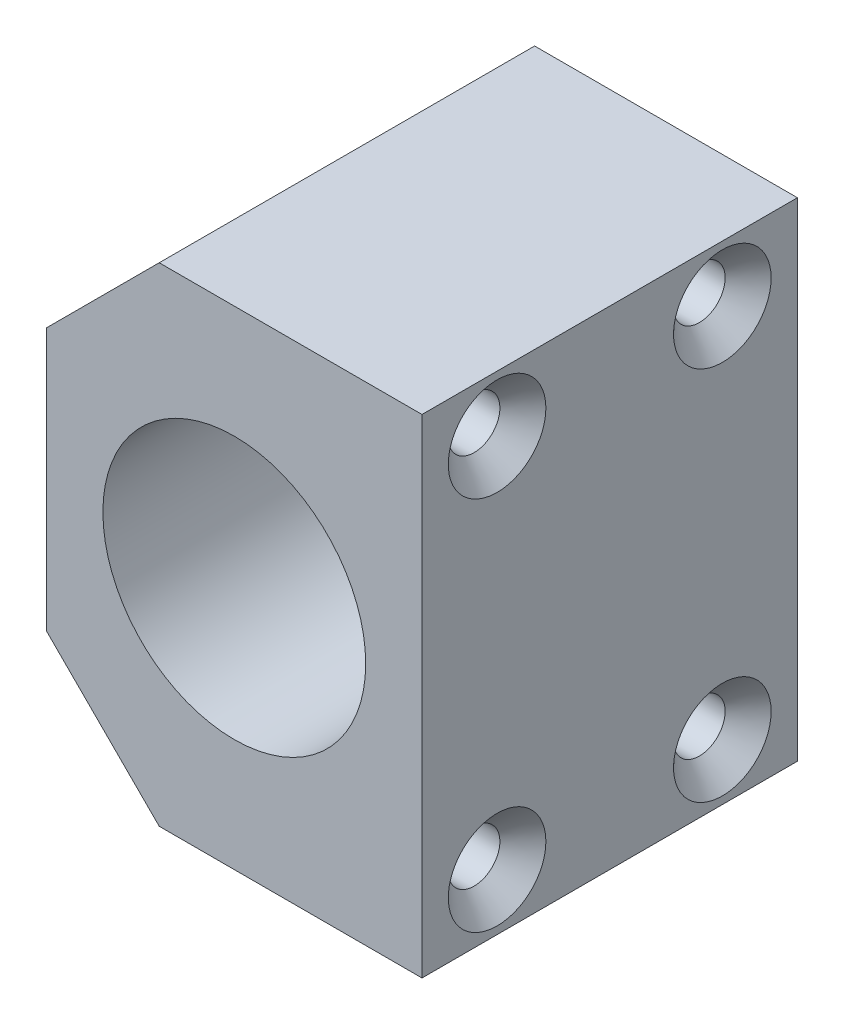
ISO-10303-21;
HEADER;
FILE_DESCRIPTION(('STEP AP214'),'2;1');
FILE_NAME('part.step','',(''),(''),'','','');
FILE_SCHEMA(('AUTOMOTIVE_DESIGN { 1 0 10303 214 1 1 1 1 }'));
ENDSEC;
DATA;
#1=APPLICATION_CONTEXT('core data for automotive mechanical design processes');
#2=APPLICATION_PROTOCOL_DEFINITION('international standard','automotive_design',2000,#1);
#3=PRODUCT_CONTEXT('',#1,'mechanical');
#4=PRODUCT('Part','Part','',(#3));
#5=PRODUCT_RELATED_PRODUCT_CATEGORY('part','',(#4));
#6=PRODUCT_DEFINITION_FORMATION('','',#4);
#7=PRODUCT_DEFINITION_CONTEXT('part definition',#1,'design');
#8=PRODUCT_DEFINITION('design','',#6,#7);
#9=PRODUCT_DEFINITION_SHAPE('','',#8);
#10=(LENGTH_UNIT() NAMED_UNIT(*) SI_UNIT(.MILLI.,.METRE.));
#11=(NAMED_UNIT(*) PLANE_ANGLE_UNIT() SI_UNIT($,.RADIAN.));
#12=(NAMED_UNIT(*) SI_UNIT($,.STERADIAN.) SOLID_ANGLE_UNIT());
#13=UNCERTAINTY_MEASURE_WITH_UNIT(LENGTH_MEASURE(1.E-05),#10,'distance_accuracy_value','');
#14=(GEOMETRIC_REPRESENTATION_CONTEXT(3) GLOBAL_UNCERTAINTY_ASSIGNED_CONTEXT((#13)) GLOBAL_UNIT_ASSIGNED_CONTEXT((#10,
#11,#12)) REPRESENTATION_CONTEXT('',''));
#15=CARTESIAN_POINT('',(0.,0.,0.));
#16=DIRECTION('',(0.,0.,1.));
#17=DIRECTION('',(1.,0.,0.));
#18=AXIS2_PLACEMENT_3D('',#15,#16,#17);
#19=CARTESIAN_POINT('',(20.,26.,40.));
#20=DIRECTION('',(-1.,0.,0.));
#21=DIRECTION('',(0.,0.,1.));
#22=AXIS2_PLACEMENT_3D('',#19,#20,#21);
#23=PLANE('',#22);
#24=CARTESIAN_POINT('',(20.,20.,32.));
#25=DIRECTION('',(1.,0.,0.));
#26=DIRECTION('',(0.,0.,-1.));
#27=AXIS2_PLACEMENT_3D('',#24,#25,#26);
#28=CIRCLE('',#27,5.2);
#29=CARTESIAN_POINT('',(20.,20.,26.8));
#30=VERTEX_POINT('',#29);
#31=EDGE_CURVE('E163',#30,#30,#28,.T.);
#32=ORIENTED_EDGE('',*,*,#31,.F.);
#33=EDGE_LOOP('',(#32));
#34=FACE_BOUND('',#33,.T.);
#35=CARTESIAN_POINT('',(20.,20.,8.));
#36=DIRECTION('',(1.,0.,0.));
#37=DIRECTION('',(0.,0.,-1.));
#38=AXIS2_PLACEMENT_3D('',#35,#36,#37);
#39=CIRCLE('',#38,5.2);
#40=CARTESIAN_POINT('',(20.,20.,2.8));
#41=VERTEX_POINT('',#40);
#42=EDGE_CURVE('E167',#41,#41,#39,.T.);
#43=ORIENTED_EDGE('',*,*,#42,.F.);
#44=EDGE_LOOP('',(#43));
#45=FACE_BOUND('',#44,.T.);
#46=CARTESIAN_POINT('',(20.,-20.,8.));
#47=DIRECTION('',(1.,0.,0.));
#48=DIRECTION('',(0.,0.,-1.));
#49=AXIS2_PLACEMENT_3D('',#46,#47,#48);
#50=CIRCLE('',#49,5.2);
#51=CARTESIAN_POINT('',(20.,-20.,2.8));
#52=VERTEX_POINT('',#51);
#53=EDGE_CURVE('E171',#52,#52,#50,.T.);
#54=ORIENTED_EDGE('',*,*,#53,.F.);
#55=EDGE_LOOP('',(#54));
#56=FACE_BOUND('',#55,.T.);
#57=CARTESIAN_POINT('',(20.,-20.,32.));
#58=DIRECTION('',(1.,0.,0.));
#59=DIRECTION('',(0.,0.,-1.));
#60=AXIS2_PLACEMENT_3D('',#57,#58,#59);
#61=CIRCLE('',#60,5.2);
#62=CARTESIAN_POINT('',(20.,-20.,26.8));
#63=VERTEX_POINT('',#62);
#64=EDGE_CURVE('E174',#63,#63,#61,.T.);
#65=ORIENTED_EDGE('',*,*,#64,.F.);
#66=EDGE_LOOP('',(#65));
#67=FACE_BOUND('',#66,.T.);
#68=DIRECTION('',(0.,1.,0.));
#69=VECTOR('',#68,1.);
#70=CARTESIAN_POINT('',(20.,26.,0.));
#71=LINE('',#70,#69);
#72=CARTESIAN_POINT('',(20.,-26.,0.));
#73=VERTEX_POINT('',#72);
#74=CARTESIAN_POINT('',(20.,26.,0.));
#75=VERTEX_POINT('',#74);
#76=EDGE_CURVE('E119',#73,#75,#71,.T.);
#77=ORIENTED_EDGE('',*,*,#76,.T.);
#78=DIRECTION('',(0.,0.,-1.));
#79=VECTOR('',#78,1.);
#80=CARTESIAN_POINT('',(20.,26.,40.));
#81=LINE('',#80,#79);
#82=CARTESIAN_POINT('',(20.,26.,40.));
#83=VERTEX_POINT('',#82);
#84=EDGE_CURVE('E11',#83,#75,#81,.T.);
#85=ORIENTED_EDGE('',*,*,#84,.F.);
#86=DIRECTION('',(0.,1.,0.));
#87=VECTOR('',#86,1.);
#88=CARTESIAN_POINT('',(20.,26.,40.));
#89=LINE('',#88,#87);
#90=CARTESIAN_POINT('',(20.,-26.,40.));
#91=VERTEX_POINT('',#90);
#92=EDGE_CURVE('E130',#91,#83,#89,.T.);
#93=ORIENTED_EDGE('',*,*,#92,.F.);
#94=DIRECTION('',(0.,0.,-1.));
#95=VECTOR('',#94,1.);
#96=CARTESIAN_POINT('',(20.,-26.,40.));
#97=LINE('',#96,#95);
#98=EDGE_CURVE('E115',#91,#73,#97,.T.);
#99=ORIENTED_EDGE('',*,*,#98,.T.);
#100=EDGE_LOOP('',(#77,#85,#93,#99));
#101=FACE_BOUND('',#100,.T.);
#102=ADVANCED_FACE('F32',(#34,#45,#56,#67,#101),#23,.F.);
#103=CARTESIAN_POINT('',(-8.00000000000001,26.,40.));
#104=DIRECTION('',(0.,-1.,0.));
#105=DIRECTION('',(0.,0.,-1.));
#106=AXIS2_PLACEMENT_3D('',#103,#104,#105);
#107=PLANE('',#106);
#108=DIRECTION('',(-1.,0.,0.));
#109=VECTOR('',#108,1.);
#110=CARTESIAN_POINT('',(-8.00000000000001,26.,0.));
#111=LINE('',#110,#109);
#112=CARTESIAN_POINT('',(-8.00000000000001,26.,0.));
#113=VERTEX_POINT('',#112);
#114=EDGE_CURVE('E122',#75,#113,#111,.T.);
#115=ORIENTED_EDGE('',*,*,#114,.T.);
#116=DIRECTION('',(0.,0.,-1.));
#117=VECTOR('',#116,1.);
#118=CARTESIAN_POINT('',(-8.00000000000001,26.,40.));
#119=LINE('',#118,#117);
#120=CARTESIAN_POINT('',(-8.00000000000001,26.,40.));
#121=VERTEX_POINT('',#120);
#122=EDGE_CURVE('E40',#121,#113,#119,.T.);
#123=ORIENTED_EDGE('',*,*,#122,.F.);
#124=DIRECTION('',(-1.,0.,0.));
#125=VECTOR('',#124,1.);
#126=CARTESIAN_POINT('',(-8.00000000000001,26.,40.));
#127=LINE('',#126,#125);
#128=EDGE_CURVE('E86',#83,#121,#127,.T.);
#129=ORIENTED_EDGE('',*,*,#128,.F.);
#130=ORIENTED_EDGE('',*,*,#84,.T.);
#131=EDGE_LOOP('',(#115,#123,#129,#130));
#132=FACE_BOUND('',#131,.T.);
#133=ADVANCED_FACE('F155',(#132),#107,.F.);
#134=CARTESIAN_POINT('',(-8.00000000000001,26.,40.));
#135=DIRECTION('',(0.707106781186548,-0.707106781186548,0.));
#136=DIRECTION('',(0.707106781186548,0.707106781186548,0.));
#137=AXIS2_PLACEMENT_3D('',#134,#135,#136);
#138=PLANE('',#137);
#139=DIRECTION('',(-0.707106781186548,-0.707106781186548,0.));
#140=VECTOR('',#139,1.);
#141=CARTESIAN_POINT('',(-8.00000000000001,26.,0.));
#142=LINE('',#141,#140);
#143=CARTESIAN_POINT('',(-20.,14.,0.));
#144=VERTEX_POINT('',#143);
#145=EDGE_CURVE('E125',#113,#144,#142,.T.);
#146=ORIENTED_EDGE('',*,*,#145,.T.);
#147=DIRECTION('',(0.,0.,-1.));
#148=VECTOR('',#147,1.);
#149=CARTESIAN_POINT('',(-20.,14.,40.));
#150=LINE('',#149,#148);
#151=CARTESIAN_POINT('',(-20.,14.,40.));
#152=VERTEX_POINT('',#151);
#153=EDGE_CURVE('E110',#152,#144,#150,.T.);
#154=ORIENTED_EDGE('',*,*,#153,.F.);
#155=DIRECTION('',(-0.707106781186548,-0.707106781186548,0.));
#156=VECTOR('',#155,1.);
#157=CARTESIAN_POINT('',(-8.00000000000001,26.,40.));
#158=LINE('',#157,#156);
#159=EDGE_CURVE('E101',#121,#152,#158,.T.);
#160=ORIENTED_EDGE('',*,*,#159,.F.);
#161=ORIENTED_EDGE('',*,*,#122,.T.);
#162=EDGE_LOOP('',(#146,#154,#160,#161));
#163=FACE_BOUND('',#162,.T.);
#164=ADVANCED_FACE('F136',(#163),#138,.F.);
#165=CARTESIAN_POINT('',(-20.,14.,40.));
#166=DIRECTION('',(1.,0.,0.));
#167=DIRECTION('',(0.,0.,-1.));
#168=AXIS2_PLACEMENT_3D('',#165,#166,#167);
#169=PLANE('',#168);
#170=DIRECTION('',(0.,-1.,0.));
#171=VECTOR('',#170,1.);
#172=CARTESIAN_POINT('',(-20.,14.,0.));
#173=LINE('',#172,#171);
#174=CARTESIAN_POINT('',(-20.,-14.,0.));
#175=VERTEX_POINT('',#174);
#176=EDGE_CURVE('E109',#144,#175,#173,.T.);
#177=ORIENTED_EDGE('',*,*,#176,.T.);
#178=DIRECTION('',(0.,0.,-1.));
#179=VECTOR('',#178,1.);
#180=CARTESIAN_POINT('',(-20.,-14.,40.));
#181=LINE('',#180,#179);
#182=CARTESIAN_POINT('',(-20.,-14.,40.));
#183=VERTEX_POINT('',#182);
#184=EDGE_CURVE('E106',#183,#175,#181,.T.);
#185=ORIENTED_EDGE('',*,*,#184,.F.);
#186=DIRECTION('',(0.,-1.,0.));
#187=VECTOR('',#186,1.);
#188=CARTESIAN_POINT('',(-20.,14.,40.));
#189=LINE('',#188,#187);
#190=EDGE_CURVE('E95',#152,#183,#189,.T.);
#191=ORIENTED_EDGE('',*,*,#190,.F.);
#192=ORIENTED_EDGE('',*,*,#153,.T.);
#193=EDGE_LOOP('',(#177,#185,#191,#192));
#194=FACE_BOUND('',#193,.T.);
#195=ADVANCED_FACE('F107',(#194),#169,.F.);
#196=CARTESIAN_POINT('',(-20.,-14.,40.));
#197=DIRECTION('',(0.707106781186547,0.707106781186548,0.));
#198=DIRECTION('',(-0.707106781186548,0.707106781186547,0.));
#199=AXIS2_PLACEMENT_3D('',#196,#197,#198);
#200=PLANE('',#199);
#201=DIRECTION('',(0.707106781186548,-0.707106781186547,0.));
#202=VECTOR('',#201,1.);
#203=CARTESIAN_POINT('',(-20.,-14.,0.));
#204=LINE('',#203,#202);
#205=CARTESIAN_POINT('',(-8.00000000000001,-26.,0.));
#206=VERTEX_POINT('',#205);
#207=EDGE_CURVE('E72',#175,#206,#204,.T.);
#208=ORIENTED_EDGE('',*,*,#207,.T.);
#209=DIRECTION('',(0.,0.,-1.));
#210=VECTOR('',#209,1.);
#211=CARTESIAN_POINT('',(-8.00000000000001,-26.,40.));
#212=LINE('',#211,#210);
#213=CARTESIAN_POINT('',(-8.00000000000001,-26.,40.));
#214=VERTEX_POINT('',#213);
#215=EDGE_CURVE('E111',#214,#206,#212,.T.);
#216=ORIENTED_EDGE('',*,*,#215,.F.);
#217=DIRECTION('',(0.707106781186548,-0.707106781186547,0.));
#218=VECTOR('',#217,1.);
#219=CARTESIAN_POINT('',(-20.,-14.,40.));
#220=LINE('',#219,#218);
#221=EDGE_CURVE('E99',#183,#214,#220,.T.);
#222=ORIENTED_EDGE('',*,*,#221,.F.);
#223=ORIENTED_EDGE('',*,*,#184,.T.);
#224=EDGE_LOOP('',(#208,#216,#222,#223));
#225=FACE_BOUND('',#224,.T.);
#226=ADVANCED_FACE('F113',(#225),#200,.F.);
#227=CARTESIAN_POINT('',(-8.00000000000001,-26.,40.));
#228=DIRECTION('',(0.,1.,0.));
#229=DIRECTION('',(0.,0.,1.));
#230=AXIS2_PLACEMENT_3D('',#227,#228,#229);
#231=PLANE('',#230);
#232=DIRECTION('',(1.,0.,0.));
#233=VECTOR('',#232,1.);
#234=CARTESIAN_POINT('',(-8.00000000000001,-26.,0.));
#235=LINE('',#234,#233);
#236=EDGE_CURVE('E78',#206,#73,#235,.T.);
#237=ORIENTED_EDGE('',*,*,#236,.T.);
#238=ORIENTED_EDGE('',*,*,#98,.F.);
#239=DIRECTION('',(1.,0.,0.));
#240=VECTOR('',#239,1.);
#241=CARTESIAN_POINT('',(-8.00000000000001,-26.,40.));
#242=LINE('',#241,#240);
#243=EDGE_CURVE('E48',#214,#91,#242,.T.);
#244=ORIENTED_EDGE('',*,*,#243,.F.);
#245=ORIENTED_EDGE('',*,*,#215,.T.);
#246=EDGE_LOOP('',(#237,#238,#244,#245));
#247=FACE_BOUND('',#246,.T.);
#248=ADVANCED_FACE('F143',(#247),#231,.F.);
#249=CARTESIAN_POINT('',(0.,0.,40.));
#250=DIRECTION('',(0.,0.,1.));
#251=DIRECTION('',(1.,0.,0.));
#252=AXIS2_PLACEMENT_3D('',#249,#250,#251);
#253=PLANE('',#252);
#254=CARTESIAN_POINT('',(0.,0.,40.));
#255=DIRECTION('',(0.,0.,1.));
#256=DIRECTION('',(1.,0.,0.));
#257=AXIS2_PLACEMENT_3D('',#254,#255,#256);
#258=CIRCLE('',#257,14.);
#259=CARTESIAN_POINT('',(14.,0.,40.));
#260=VERTEX_POINT('',#259);
#261=EDGE_CURVE('E189',#260,#260,#258,.T.);
#262=ORIENTED_EDGE('',*,*,#261,.F.);
#263=EDGE_LOOP('',(#262));
#264=FACE_BOUND('',#263,.T.);
#265=ORIENTED_EDGE('',*,*,#92,.T.);
#266=ORIENTED_EDGE('',*,*,#128,.T.);
#267=ORIENTED_EDGE('',*,*,#159,.T.);
#268=ORIENTED_EDGE('',*,*,#190,.T.);
#269=ORIENTED_EDGE('',*,*,#221,.T.);
#270=ORIENTED_EDGE('',*,*,#243,.T.);
#271=EDGE_LOOP('',(#265,#266,#267,#268,#269,#270));
#272=FACE_BOUND('',#271,.T.);
#273=ADVANCED_FACE('F97',(#264,#272),#253,.T.);
#274=CARTESIAN_POINT('',(0.,0.,0.));
#275=DIRECTION('',(0.,0.,1.));
#276=DIRECTION('',(1.,0.,0.));
#277=AXIS2_PLACEMENT_3D('',#274,#275,#276);
#278=PLANE('',#277);
#279=CARTESIAN_POINT('',(0.,0.,0.));
#280=DIRECTION('',(0.,0.,1.));
#281=DIRECTION('',(1.,0.,0.));
#282=AXIS2_PLACEMENT_3D('',#279,#280,#281);
#283=CIRCLE('',#282,14.);
#284=CARTESIAN_POINT('',(14.,0.,0.));
#285=VERTEX_POINT('',#284);
#286=EDGE_CURVE('E123',#285,#285,#283,.T.);
#287=ORIENTED_EDGE('',*,*,#286,.T.);
#288=EDGE_LOOP('',(#287));
#289=FACE_BOUND('',#288,.T.);
#290=ORIENTED_EDGE('',*,*,#76,.F.);
#291=ORIENTED_EDGE('',*,*,#236,.F.);
#292=ORIENTED_EDGE('',*,*,#207,.F.);
#293=ORIENTED_EDGE('',*,*,#176,.F.);
#294=ORIENTED_EDGE('',*,*,#145,.F.);
#295=ORIENTED_EDGE('',*,*,#114,.F.);
#296=EDGE_LOOP('',(#290,#291,#292,#293,#294,#295));
#297=FACE_BOUND('',#296,.T.);
#298=ADVANCED_FACE('F139',(#289,#297),#278,.F.);
#299=CARTESIAN_POINT('',(0.,0.,0.));
#300=DIRECTION('',(0.,0.,1.));
#301=DIRECTION('',(1.,0.,0.));
#302=AXIS2_PLACEMENT_3D('',#299,#300,#301);
#303=CYLINDRICAL_SURFACE('',#302,14.);
#304=ORIENTED_EDGE('',*,*,#286,.F.);
#305=EDGE_LOOP('',(#304));
#306=FACE_BOUND('',#305,.T.);
#307=ORIENTED_EDGE('',*,*,#261,.T.);
#308=EDGE_LOOP('',(#307));
#309=FACE_BOUND('',#308,.T.);
#310=ADVANCED_FACE('F197',(#306,#309),#303,.F.);
#311=CARTESIAN_POINT('',(7.99999999999999,-20.,32.));
#312=DIRECTION('',(1.,0.,0.));
#313=DIRECTION('',(0.,0.,-1.));
#314=AXIS2_PLACEMENT_3D('',#311,#312,#313);
#315=CONICAL_SURFACE('',#314,2.74999999999998,1.02974425867665);
#316=CARTESIAN_POINT('',(6.34763329767421,-20.,32.));
#317=VERTEX_POINT('',#316);
#318=VERTEX_LOOP('',#317);
#319=FACE_BOUND('',#318,.T.);
#320=CARTESIAN_POINT('',(7.99999999999999,-20.,32.));
#321=DIRECTION('',(1.,0.,0.));
#322=DIRECTION('',(0.,0.,-1.));
#323=AXIS2_PLACEMENT_3D('',#320,#321,#322);
#324=CIRCLE('',#323,2.74999999999998);
#325=CARTESIAN_POINT('',(7.99999999999999,-20.,29.25));
#326=VERTEX_POINT('',#325);
#327=EDGE_CURVE('E180',#326,#326,#324,.T.);
#328=ORIENTED_EDGE('',*,*,#327,.T.);
#329=EDGE_LOOP('',(#328));
#330=FACE_BOUND('',#329,.T.);
#331=ADVANCED_FACE('F199',(#319,#330),#315,.F.);
#332=CARTESIAN_POINT('',(20.,-20.,32.));
#333=DIRECTION('',(1.,0.,0.));
#334=DIRECTION('',(0.,0.,-1.));
#335=AXIS2_PLACEMENT_3D('',#332,#333,#334);
#336=CYLINDRICAL_SURFACE('',#335,2.74999999999999);
#337=ORIENTED_EDGE('',*,*,#327,.F.);
#338=EDGE_LOOP('',(#337));
#339=FACE_BOUND('',#338,.T.);
#340=CARTESIAN_POINT('',(17.55,-20.,32.));
#341=DIRECTION('',(1.,0.,0.));
#342=DIRECTION('',(0.,0.,-1.));
#343=AXIS2_PLACEMENT_3D('',#340,#341,#342);
#344=CIRCLE('',#343,2.75);
#345=CARTESIAN_POINT('',(17.55,-20.,29.25));
#346=VERTEX_POINT('',#345);
#347=EDGE_CURVE('E176',#346,#346,#344,.T.);
#348=ORIENTED_EDGE('',*,*,#347,.T.);
#349=EDGE_LOOP('',(#348));
#350=FACE_BOUND('',#349,.T.);
#351=ADVANCED_FACE('F206',(#339,#350),#336,.F.);
#352=CARTESIAN_POINT('',(20.,-20.,32.));
#353=DIRECTION('',(1.,0.,0.));
#354=DIRECTION('',(0.,0.,-1.));
#355=AXIS2_PLACEMENT_3D('',#352,#353,#354);
#356=CONICAL_SURFACE('',#355,5.2,0.785398163397448);
#357=ORIENTED_EDGE('',*,*,#347,.F.);
#358=EDGE_LOOP('',(#357));
#359=FACE_BOUND('',#358,.T.);
#360=ORIENTED_EDGE('',*,*,#64,.T.);
#361=EDGE_LOOP('',(#360));
#362=FACE_BOUND('',#361,.T.);
#363=ADVANCED_FACE('F214',(#359,#362),#356,.F.);
#364=CARTESIAN_POINT('',(7.99999999999999,-20.,8.));
#365=DIRECTION('',(1.,0.,0.));
#366=DIRECTION('',(0.,0.,-1.));
#367=AXIS2_PLACEMENT_3D('',#364,#365,#366);
#368=CONICAL_SURFACE('',#367,2.74999999999999,1.02974425867665);
#369=CARTESIAN_POINT('',(6.34763329767421,-20.,8.));
#370=VERTEX_POINT('',#369);
#371=VERTEX_LOOP('',#370);
#372=FACE_BOUND('',#371,.T.);
#373=CARTESIAN_POINT('',(7.99999999999999,-20.,8.));
#374=DIRECTION('',(1.,0.,0.));
#375=DIRECTION('',(0.,0.,-1.));
#376=AXIS2_PLACEMENT_3D('',#373,#374,#375);
#377=CIRCLE('',#376,2.74999999999999);
#378=CARTESIAN_POINT('',(7.99999999999999,-20.,5.25000000000001));
#379=VERTEX_POINT('',#378);
#380=EDGE_CURVE('E177',#379,#379,#377,.T.);
#381=ORIENTED_EDGE('',*,*,#380,.T.);
#382=EDGE_LOOP('',(#381));
#383=FACE_BOUND('',#382,.T.);
#384=ADVANCED_FACE('F218',(#372,#383),#368,.F.);
#385=CARTESIAN_POINT('',(20.,-20.,8.));
#386=DIRECTION('',(1.,0.,0.));
#387=DIRECTION('',(0.,0.,-1.));
#388=AXIS2_PLACEMENT_3D('',#385,#386,#387);
#389=CYLINDRICAL_SURFACE('',#388,2.74999999999999);
#390=ORIENTED_EDGE('',*,*,#380,.F.);
#391=EDGE_LOOP('',(#390));
#392=FACE_BOUND('',#391,.T.);
#393=CARTESIAN_POINT('',(17.55,-20.,8.));
#394=DIRECTION('',(1.,0.,0.));
#395=DIRECTION('',(0.,0.,-1.));
#396=AXIS2_PLACEMENT_3D('',#393,#394,#395);
#397=CIRCLE('',#396,2.75);
#398=CARTESIAN_POINT('',(17.55,-20.,5.25));
#399=VERTEX_POINT('',#398);
#400=EDGE_CURVE('E183',#399,#399,#397,.T.);
#401=ORIENTED_EDGE('',*,*,#400,.T.);
#402=EDGE_LOOP('',(#401));
#403=FACE_BOUND('',#402,.T.);
#404=ADVANCED_FACE('F222',(#392,#403),#389,.F.);
#405=CARTESIAN_POINT('',(20.,-20.,8.));
#406=DIRECTION('',(1.,0.,0.));
#407=DIRECTION('',(0.,0.,-1.));
#408=AXIS2_PLACEMENT_3D('',#405,#406,#407);
#409=CONICAL_SURFACE('',#408,5.2,0.785398163397448);
#410=ORIENTED_EDGE('',*,*,#400,.F.);
#411=EDGE_LOOP('',(#410));
#412=FACE_BOUND('',#411,.T.);
#413=ORIENTED_EDGE('',*,*,#53,.T.);
#414=EDGE_LOOP('',(#413));
#415=FACE_BOUND('',#414,.T.);
#416=ADVANCED_FACE('F226',(#412,#415),#409,.F.);
#417=CARTESIAN_POINT('',(7.99999999999999,20.,8.));
#418=DIRECTION('',(1.,0.,0.));
#419=DIRECTION('',(0.,0.,-1.));
#420=AXIS2_PLACEMENT_3D('',#417,#418,#419);
#421=CONICAL_SURFACE('',#420,2.74999999999998,1.02974425867665);
#422=CARTESIAN_POINT('',(6.34763329767421,20.,8.));
#423=VERTEX_POINT('',#422);
#424=VERTEX_LOOP('',#423);
#425=FACE_BOUND('',#424,.T.);
#426=CARTESIAN_POINT('',(7.99999999999999,20.,8.));
#427=DIRECTION('',(1.,0.,0.));
#428=DIRECTION('',(0.,0.,-1.));
#429=AXIS2_PLACEMENT_3D('',#426,#427,#428);
#430=CIRCLE('',#429,2.74999999999998);
#431=CARTESIAN_POINT('',(7.99999999999999,20.,5.25000000000002));
#432=VERTEX_POINT('',#431);
#433=EDGE_CURVE('E270',#432,#432,#430,.T.);
#434=ORIENTED_EDGE('',*,*,#433,.T.);
#435=EDGE_LOOP('',(#434));
#436=FACE_BOUND('',#435,.T.);
#437=ADVANCED_FACE('F230',(#425,#436),#421,.F.);
#438=CARTESIAN_POINT('',(20.,20.,8.));
#439=DIRECTION('',(1.,0.,0.));
#440=DIRECTION('',(0.,0.,-1.));
#441=AXIS2_PLACEMENT_3D('',#438,#439,#440);
#442=CYLINDRICAL_SURFACE('',#441,2.74999999999999);
#443=ORIENTED_EDGE('',*,*,#433,.F.);
#444=EDGE_LOOP('',(#443));
#445=FACE_BOUND('',#444,.T.);
#446=CARTESIAN_POINT('',(17.55,20.,8.));
#447=DIRECTION('',(1.,0.,0.));
#448=DIRECTION('',(0.,0.,-1.));
#449=AXIS2_PLACEMENT_3D('',#446,#447,#448);
#450=CIRCLE('',#449,2.75);
#451=CARTESIAN_POINT('',(17.55,20.,5.25));
#452=VERTEX_POINT('',#451);
#453=EDGE_CURVE('E267',#452,#452,#450,.T.);
#454=ORIENTED_EDGE('',*,*,#453,.T.);
#455=EDGE_LOOP('',(#454));
#456=FACE_BOUND('',#455,.T.);
#457=ADVANCED_FACE('F234',(#445,#456),#442,.F.);
#458=CARTESIAN_POINT('',(20.,20.,8.));
#459=DIRECTION('',(1.,0.,0.));
#460=DIRECTION('',(0.,0.,-1.));
#461=AXIS2_PLACEMENT_3D('',#458,#459,#460);
#462=CONICAL_SURFACE('',#461,5.2,0.785398163397448);
#463=ORIENTED_EDGE('',*,*,#453,.F.);
#464=EDGE_LOOP('',(#463));
#465=FACE_BOUND('',#464,.T.);
#466=ORIENTED_EDGE('',*,*,#42,.T.);
#467=EDGE_LOOP('',(#466));
#468=FACE_BOUND('',#467,.T.);
#469=ADVANCED_FACE('F238',(#465,#468),#462,.F.);
#470=CARTESIAN_POINT('',(7.99999999999999,20.,32.));
#471=DIRECTION('',(1.,0.,0.));
#472=DIRECTION('',(0.,0.,-1.));
#473=AXIS2_PLACEMENT_3D('',#470,#471,#472);
#474=CONICAL_SURFACE('',#473,2.74999999999998,1.02974425867665);
#475=CARTESIAN_POINT('',(6.34763329767421,20.,32.));
#476=VERTEX_POINT('',#475);
#477=VERTEX_LOOP('',#476);
#478=FACE_BOUND('',#477,.T.);
#479=CARTESIAN_POINT('',(7.99999999999999,20.,32.));
#480=DIRECTION('',(1.,0.,0.));
#481=DIRECTION('',(0.,0.,-1.));
#482=AXIS2_PLACEMENT_3D('',#479,#480,#481);
#483=CIRCLE('',#482,2.74999999999998);
#484=CARTESIAN_POINT('',(7.99999999999999,20.,29.25));
#485=VERTEX_POINT('',#484);
#486=EDGE_CURVE('E261',#485,#485,#483,.T.);
#487=ORIENTED_EDGE('',*,*,#486,.T.);
#488=EDGE_LOOP('',(#487));
#489=FACE_BOUND('',#488,.T.);
#490=ADVANCED_FACE('F242',(#478,#489),#474,.F.);
#491=CARTESIAN_POINT('',(20.,20.,32.));
#492=DIRECTION('',(1.,0.,0.));
#493=DIRECTION('',(0.,0.,-1.));
#494=AXIS2_PLACEMENT_3D('',#491,#492,#493);
#495=CYLINDRICAL_SURFACE('',#494,2.74999999999999);
#496=ORIENTED_EDGE('',*,*,#486,.F.);
#497=EDGE_LOOP('',(#496));
#498=FACE_BOUND('',#497,.T.);
#499=CARTESIAN_POINT('',(17.55,20.,32.));
#500=DIRECTION('',(1.,0.,0.));
#501=DIRECTION('',(0.,0.,-1.));
#502=AXIS2_PLACEMENT_3D('',#499,#500,#501);
#503=CIRCLE('',#502,2.75);
#504=CARTESIAN_POINT('',(17.55,20.,29.25));
#505=VERTEX_POINT('',#504);
#506=EDGE_CURVE('E259',#505,#505,#503,.T.);
#507=ORIENTED_EDGE('',*,*,#506,.T.);
#508=EDGE_LOOP('',(#507));
#509=FACE_BOUND('',#508,.T.);
#510=ADVANCED_FACE('F246',(#498,#509),#495,.F.);
#511=CARTESIAN_POINT('',(20.,20.,32.));
#512=DIRECTION('',(1.,0.,0.));
#513=DIRECTION('',(0.,0.,-1.));
#514=AXIS2_PLACEMENT_3D('',#511,#512,#513);
#515=CONICAL_SURFACE('',#514,5.2,0.785398163397448);
#516=ORIENTED_EDGE('',*,*,#506,.F.);
#517=EDGE_LOOP('',(#516));
#518=FACE_BOUND('',#517,.T.);
#519=ORIENTED_EDGE('',*,*,#31,.T.);
#520=EDGE_LOOP('',(#519));
#521=FACE_BOUND('',#520,.T.);
#522=ADVANCED_FACE('F250',(#518,#521),#515,.F.);
#523=CLOSED_SHELL('',(#102,#133,#164,#195,#226,#248,#273,#298,#310,#331,#351,#363,#384,#404,
#416,#437,#457,#469,#490,#510,#522));
#524=MANIFOLD_SOLID_BREP('B2',#523);
#525=ADVANCED_BREP_SHAPE_REPRESENTATION('',(#18,#524),#14);
#526=SHAPE_DEFINITION_REPRESENTATION(#9,#525);
ENDSEC;
END-ISO-10303-21;
